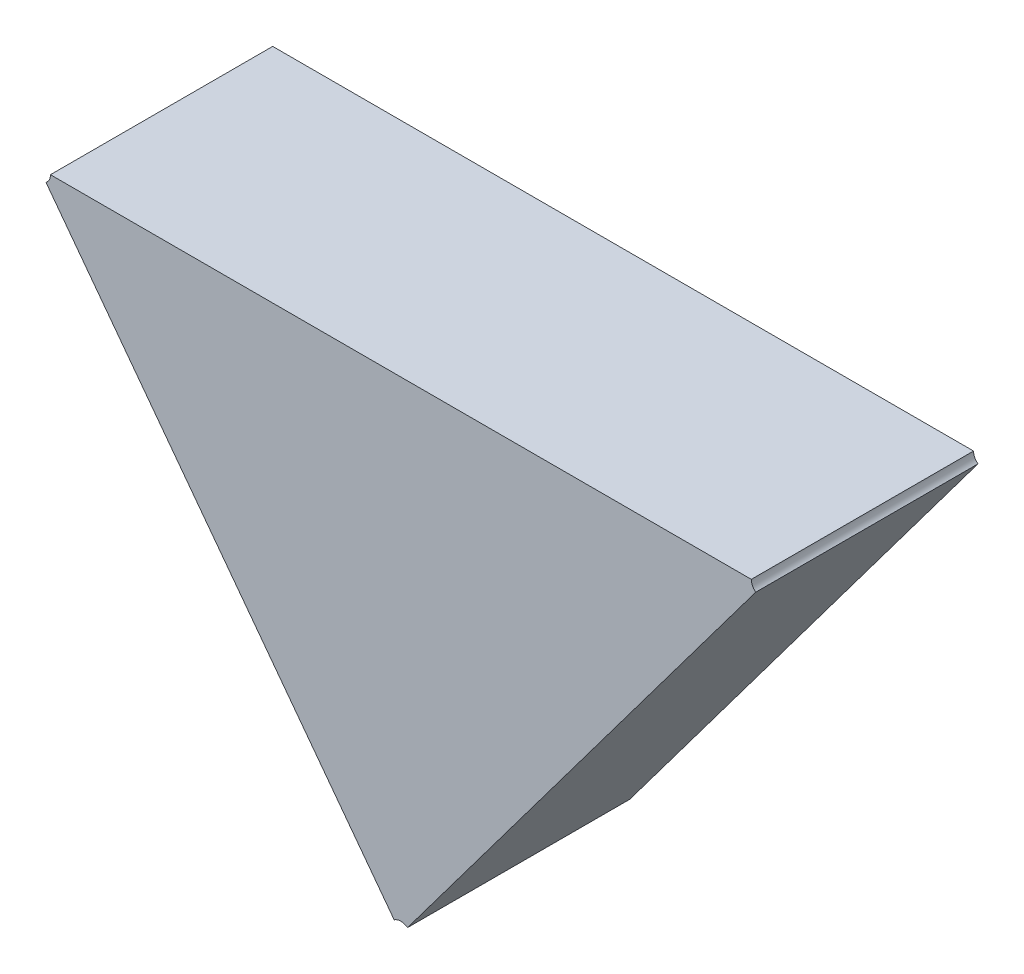
ISO-10303-21;
HEADER;
FILE_DESCRIPTION(('STEP AP214'),'2;1');
FILE_NAME('part.step','',(''),(''),'','','');
FILE_SCHEMA(('AUTOMOTIVE_DESIGN { 1 0 10303 214 1 1 1 1 }'));
ENDSEC;
DATA;
#1=APPLICATION_CONTEXT('core data for automotive mechanical design processes');
#2=APPLICATION_PROTOCOL_DEFINITION('international standard','automotive_design',2000,#1);
#3=PRODUCT_CONTEXT('',#1,'mechanical');
#4=PRODUCT('Part','Part','',(#3));
#5=PRODUCT_RELATED_PRODUCT_CATEGORY('part','',(#4));
#6=PRODUCT_DEFINITION_FORMATION('','',#4);
#7=PRODUCT_DEFINITION_CONTEXT('part definition',#1,'design');
#8=PRODUCT_DEFINITION('design','',#6,#7);
#9=PRODUCT_DEFINITION_SHAPE('','',#8);
#10=(LENGTH_UNIT() NAMED_UNIT(*) SI_UNIT(.MILLI.,.METRE.));
#11=(NAMED_UNIT(*) PLANE_ANGLE_UNIT() SI_UNIT($,.RADIAN.));
#12=(NAMED_UNIT(*) SI_UNIT($,.STERADIAN.) SOLID_ANGLE_UNIT());
#13=UNCERTAINTY_MEASURE_WITH_UNIT(LENGTH_MEASURE(1.E-05),#10,'distance_accuracy_value','');
#14=(GEOMETRIC_REPRESENTATION_CONTEXT(3) GLOBAL_UNCERTAINTY_ASSIGNED_CONTEXT((#13)) GLOBAL_UNIT_ASSIGNED_CONTEXT((#10,
#11,#12)) REPRESENTATION_CONTEXT('',''));
#15=CARTESIAN_POINT('',(0.,0.,0.));
#16=DIRECTION('',(0.,0.,1.));
#17=DIRECTION('',(1.,0.,0.));
#18=AXIS2_PLACEMENT_3D('',#15,#16,#17);
#19=CARTESIAN_POINT('',(-1.484759283037,-1.125869847781,0.1));
#20=DIRECTION('',(0.,0.,1.));
#21=DIRECTION('',(1.,0.,0.));
#22=AXIS2_PLACEMENT_3D('',#19,#20,#21);
#23=PLANE('',#22);
#24=CARTESIAN_POINT('',(-1.701648957739,-1.044463865233,0.1));
#25=DIRECTION('',(0.,0.,-1.));
#26=DIRECTION('',(-1.,0.,0.));
#27=AXIS2_PLACEMENT_3D('',#24,#25,#26);
#28=CIRCLE('',#27,0.00499999999999997);
#29=CARTESIAN_POINT('',(-1.696648957739,-1.044463865233,0.1));
#30=VERTEX_POINT('',#29);
#31=CARTESIAN_POINT('',(-1.698650323625,-1.048464889283,0.1));
#32=VERTEX_POINT('',#31);
#33=EDGE_CURVE('E11',#30,#32,#28,.T.);
#34=ORIENTED_EDGE('',*,*,#33,.T.);
#35=DIRECTION('',(-0.599726822848934,0.800204810005241,0.));
#36=VECTOR('',#35,1.);
#37=CARTESIAN_POINT('',(-1.538975916512,-1.261515604607,0.1));
#38=LINE('',#37,#36);
#39=CARTESIAN_POINT('',(-1.541974550626,-1.257514580557,0.1));
#40=VERTEX_POINT('',#39);
#41=EDGE_CURVE('E24',#40,#32,#38,.T.);
#42=ORIENTED_EDGE('',*,*,#41,.F.);
#43=CARTESIAN_POINT('',(-1.538975916512,-1.261515604607,0.1));
#44=DIRECTION('',(0.,0.,-1.));
#45=DIRECTION('',(-1.,0.,0.));
#46=AXIS2_PLACEMENT_3D('',#43,#44,#45);
#47=CIRCLE('',#46,0.00500000000000008);
#48=CARTESIAN_POINT('',(-1.535977282398,-1.257514580557,0.1));
#49=VERTEX_POINT('',#48);
#50=EDGE_CURVE('E87',#40,#49,#47,.T.);
#51=ORIENTED_EDGE('',*,*,#50,.T.);
#52=DIRECTION('',(0.599726822848934,0.800204810005241,0.));
#53=VECTOR('',#52,1.);
#54=CARTESIAN_POINT('',(-1.538975916512,-1.261515604607,0.1));
#55=LINE('',#54,#53);
#56=CARTESIAN_POINT('',(-1.379301509399,-1.048464889283,0.1));
#57=VERTEX_POINT('',#56);
#58=EDGE_CURVE('E112',#49,#57,#55,.T.);
#59=ORIENTED_EDGE('',*,*,#58,.T.);
#60=CARTESIAN_POINT('',(-1.376302875285,-1.044463865233,0.1));
#61=DIRECTION('',(0.,0.,-1.));
#62=DIRECTION('',(-1.,0.,0.));
#63=AXIS2_PLACEMENT_3D('',#60,#61,#62);
#64=CIRCLE('',#63,0.00500000000000005);
#65=CARTESIAN_POINT('',(-1.381302875285,-1.044463865233,0.1));
#66=VERTEX_POINT('',#65);
#67=EDGE_CURVE('E110',#57,#66,#64,.T.);
#68=ORIENTED_EDGE('',*,*,#67,.T.);
#69=DIRECTION('',(-1.,0.,0.));
#70=VECTOR('',#69,1.);
#71=CARTESIAN_POINT('',(-1.376302875285,-1.044463865233,0.1));
#72=LINE('',#71,#70);
#73=EDGE_CURVE('E108',#66,#30,#72,.T.);
#74=ORIENTED_EDGE('',*,*,#73,.T.);
#75=EDGE_LOOP('',(#34,#42,#51,#59,#68,#74));
#76=FACE_BOUND('',#75,.T.);
#77=ADVANCED_FACE('F17',(#76),#23,.T.);
#78=CARTESIAN_POINT('',(-1.376302875285,-1.044463865233,0.));
#79=DIRECTION('',(0.,1.,0.));
#80=DIRECTION('',(-1.,0.,0.));
#81=AXIS2_PLACEMENT_3D('',#78,#79,#80);
#82=PLANE('',#81);
#83=DIRECTION('',(0.,0.,1.));
#84=VECTOR('',#83,1.);
#85=CARTESIAN_POINT('',(-1.696648957739,-1.044463865233,0.1));
#86=LINE('',#85,#84);
#87=CARTESIAN_POINT('',(-1.696648957739,-1.044463865233,0.));
#88=VERTEX_POINT('',#87);
#89=EDGE_CURVE('E105',#88,#30,#86,.T.);
#90=ORIENTED_EDGE('',*,*,#89,.T.);
#91=ORIENTED_EDGE('',*,*,#73,.F.);
#92=DIRECTION('',(0.,0.,-1.));
#93=VECTOR('',#92,1.);
#94=CARTESIAN_POINT('',(-1.381302875285,-1.044463865233,0.1));
#95=LINE('',#94,#93);
#96=CARTESIAN_POINT('',(-1.381302875285,-1.044463865233,0.));
#97=VERTEX_POINT('',#96);
#98=EDGE_CURVE('E103',#66,#97,#95,.T.);
#99=ORIENTED_EDGE('',*,*,#98,.T.);
#100=DIRECTION('',(-1.,0.,0.));
#101=VECTOR('',#100,1.);
#102=CARTESIAN_POINT('',(-1.376302875285,-1.044463865233,0.));
#103=LINE('',#102,#101);
#104=EDGE_CURVE('E100',#97,#88,#103,.T.);
#105=ORIENTED_EDGE('',*,*,#104,.T.);
#106=EDGE_LOOP('',(#90,#91,#99,#105));
#107=FACE_BOUND('',#106,.T.);
#108=ADVANCED_FACE('F127',(#107),#82,.T.);
#109=CARTESIAN_POINT('',(-1.538975916512,-1.261515604607,0.));
#110=DIRECTION('',(0.800204810005241,-0.599726822848934,0.));
#111=DIRECTION('',(0.599726822848934,0.800204810005241,0.));
#112=AXIS2_PLACEMENT_3D('',#109,#110,#111);
#113=PLANE('',#112);
#114=DIRECTION('',(0.,0.,-1.));
#115=VECTOR('',#114,1.);
#116=CARTESIAN_POINT('',(-1.535977282398,-1.257514580557,0.1));
#117=LINE('',#116,#115);
#118=CARTESIAN_POINT('',(-1.535977282398,-1.257514580557,0.));
#119=VERTEX_POINT('',#118);
#120=EDGE_CURVE('E98',#49,#119,#117,.T.);
#121=ORIENTED_EDGE('',*,*,#120,.T.);
#122=DIRECTION('',(0.599726822848934,0.800204810005241,0.));
#123=VECTOR('',#122,1.);
#124=CARTESIAN_POINT('',(-1.538975916512,-1.261515604607,0.));
#125=LINE('',#124,#123);
#126=CARTESIAN_POINT('',(-1.379301509399,-1.048464889283,0.));
#127=VERTEX_POINT('',#126);
#128=EDGE_CURVE('E73',#119,#127,#125,.T.);
#129=ORIENTED_EDGE('',*,*,#128,.T.);
#130=DIRECTION('',(0.,0.,1.));
#131=VECTOR('',#130,1.);
#132=CARTESIAN_POINT('',(-1.379301509399,-1.048464889283,0.1));
#133=LINE('',#132,#131);
#134=EDGE_CURVE('E94',#127,#57,#133,.T.);
#135=ORIENTED_EDGE('',*,*,#134,.T.);
#136=ORIENTED_EDGE('',*,*,#58,.F.);
#137=EDGE_LOOP('',(#121,#129,#135,#136));
#138=FACE_BOUND('',#137,.T.);
#139=ADVANCED_FACE('F125',(#138),#113,.T.);
#140=CARTESIAN_POINT('',(-1.484759283037,-1.125869847781,0.));
#141=DIRECTION('',(0.,0.,1.));
#142=DIRECTION('',(1.,0.,0.));
#143=AXIS2_PLACEMENT_3D('',#140,#141,#142);
#144=PLANE('',#143);
#145=CARTESIAN_POINT('',(-1.701648957739,-1.044463865233,0.));
#146=DIRECTION('',(0.,0.,1.));
#147=DIRECTION('',(-1.,0.,0.));
#148=AXIS2_PLACEMENT_3D('',#145,#146,#147);
#149=CIRCLE('',#148,0.00499999999999997);
#150=CARTESIAN_POINT('',(-1.698650323625,-1.048464889283,0.));
#151=VERTEX_POINT('',#150);
#152=EDGE_CURVE('E92',#151,#88,#149,.T.);
#153=ORIENTED_EDGE('',*,*,#152,.T.);
#154=ORIENTED_EDGE('',*,*,#104,.F.);
#155=CARTESIAN_POINT('',(-1.376302875285,-1.044463865233,0.));
#156=DIRECTION('',(0.,0.,1.));
#157=DIRECTION('',(-1.,0.,0.));
#158=AXIS2_PLACEMENT_3D('',#155,#156,#157);
#159=CIRCLE('',#158,0.00500000000000005);
#160=EDGE_CURVE('E77',#97,#127,#159,.T.);
#161=ORIENTED_EDGE('',*,*,#160,.T.);
#162=ORIENTED_EDGE('',*,*,#128,.F.);
#163=CARTESIAN_POINT('',(-1.538975916512,-1.261515604607,0.));
#164=DIRECTION('',(0.,0.,1.));
#165=DIRECTION('',(-1.,0.,0.));
#166=AXIS2_PLACEMENT_3D('',#163,#164,#165);
#167=CIRCLE('',#166,0.00500000000000008);
#168=CARTESIAN_POINT('',(-1.541974550626,-1.257514580557,0.));
#169=VERTEX_POINT('',#168);
#170=EDGE_CURVE('E66',#119,#169,#167,.T.);
#171=ORIENTED_EDGE('',*,*,#170,.T.);
#172=DIRECTION('',(-0.599726822848934,0.800204810005241,0.));
#173=VECTOR('',#172,1.);
#174=CARTESIAN_POINT('',(-1.538975916512,-1.261515604607,0.));
#175=LINE('',#174,#173);
#176=EDGE_CURVE('E70',#169,#151,#175,.T.);
#177=ORIENTED_EDGE('',*,*,#176,.T.);
#178=EDGE_LOOP('',(#153,#154,#161,#162,#171,#177));
#179=FACE_BOUND('',#178,.T.);
#180=ADVANCED_FACE('F69',(#179),#144,.F.);
#181=CARTESIAN_POINT('',(-1.538975916512,-1.261515604607,0.));
#182=DIRECTION('',(0.800204810005241,0.599726822848934,0.));
#183=DIRECTION('',(-0.599726822848934,0.800204810005241,0.));
#184=AXIS2_PLACEMENT_3D('',#181,#182,#183);
#185=PLANE('',#184);
#186=DIRECTION('',(0.,0.,-1.));
#187=VECTOR('',#186,1.);
#188=CARTESIAN_POINT('',(-1.698650323625,-1.048464889283,0.1));
#189=LINE('',#188,#187);
#190=EDGE_CURVE('E83',#32,#151,#189,.T.);
#191=ORIENTED_EDGE('',*,*,#190,.T.);
#192=ORIENTED_EDGE('',*,*,#176,.F.);
#193=DIRECTION('',(0.,0.,1.));
#194=VECTOR('',#193,1.);
#195=CARTESIAN_POINT('',(-1.541974550626,-1.257514580557,0.1));
#196=LINE('',#195,#194);
#197=EDGE_CURVE('E82',#169,#40,#196,.T.);
#198=ORIENTED_EDGE('',*,*,#197,.T.);
#199=ORIENTED_EDGE('',*,*,#41,.T.);
#200=EDGE_LOOP('',(#191,#192,#198,#199));
#201=FACE_BOUND('',#200,.T.);
#202=ADVANCED_FACE('F81',(#201),#185,.F.);
#203=CARTESIAN_POINT('',(-1.376302875285,-1.044463865233,0.1));
#204=DIRECTION('',(0.,0.,1.));
#205=DIRECTION('',(-1.,0.,0.));
#206=AXIS2_PLACEMENT_3D('',#203,#204,#205);
#207=CYLINDRICAL_SURFACE('',#206,0.00500000000000005);
#208=ORIENTED_EDGE('',*,*,#98,.F.);
#209=ORIENTED_EDGE('',*,*,#67,.F.);
#210=ORIENTED_EDGE('',*,*,#134,.F.);
#211=ORIENTED_EDGE('',*,*,#160,.F.);
#212=EDGE_LOOP('',(#208,#209,#210,#211));
#213=FACE_BOUND('',#212,.T.);
#214=ADVANCED_FACE('F121',(#213),#207,.F.);
#215=CARTESIAN_POINT('',(-1.538975916512,-1.261515604607,0.1));
#216=DIRECTION('',(0.,0.,1.));
#217=DIRECTION('',(-1.,0.,0.));
#218=AXIS2_PLACEMENT_3D('',#215,#216,#217);
#219=CYLINDRICAL_SURFACE('',#218,0.00500000000000008);
#220=ORIENTED_EDGE('',*,*,#120,.F.);
#221=ORIENTED_EDGE('',*,*,#50,.F.);
#222=ORIENTED_EDGE('',*,*,#197,.F.);
#223=ORIENTED_EDGE('',*,*,#170,.F.);
#224=EDGE_LOOP('',(#220,#221,#222,#223));
#225=FACE_BOUND('',#224,.T.);
#226=ADVANCED_FACE('F86',(#225),#219,.F.);
#227=CARTESIAN_POINT('',(-1.701648957739,-1.044463865233,0.1));
#228=DIRECTION('',(0.,0.,1.));
#229=DIRECTION('',(-1.,0.,0.));
#230=AXIS2_PLACEMENT_3D('',#227,#228,#229);
#231=CYLINDRICAL_SURFACE('',#230,0.00499999999999997);
#232=ORIENTED_EDGE('',*,*,#89,.F.);
#233=ORIENTED_EDGE('',*,*,#152,.F.);
#234=ORIENTED_EDGE('',*,*,#190,.F.);
#235=ORIENTED_EDGE('',*,*,#33,.F.);
#236=EDGE_LOOP('',(#232,#233,#234,#235));
#237=FACE_BOUND('',#236,.T.);
#238=ADVANCED_FACE('F114',(#237),#231,.F.);
#239=CLOSED_SHELL('',(#77,#108,#139,#180,#202,#214,#226,#238));
#240=MANIFOLD_SOLID_BREP('B1',#239);
#241=ADVANCED_BREP_SHAPE_REPRESENTATION('',(#18,#240),#14);
#242=SHAPE_DEFINITION_REPRESENTATION(#9,#241);
ENDSEC;
END-ISO-10303-21;
